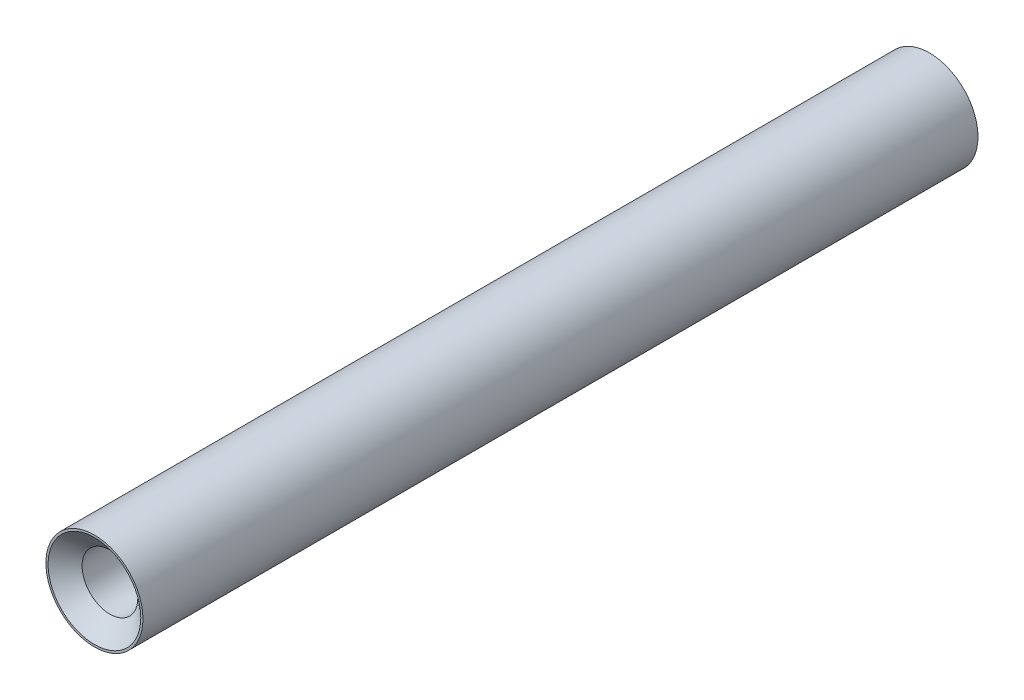
ISO-10303-21;
HEADER;
FILE_DESCRIPTION(('STEP AP214'),'2;1');
FILE_NAME('part.step','',(''),(''),'','','');
FILE_SCHEMA(('AUTOMOTIVE_DESIGN { 1 0 10303 214 1 1 1 1 }'));
ENDSEC;
DATA;
#1=APPLICATION_CONTEXT('core data for automotive mechanical design processes');
#2=APPLICATION_PROTOCOL_DEFINITION('international standard','automotive_design',2000,#1);
#3=PRODUCT_CONTEXT('',#1,'mechanical');
#4=PRODUCT('Part','Part','',(#3));
#5=PRODUCT_RELATED_PRODUCT_CATEGORY('part','',(#4));
#6=PRODUCT_DEFINITION_FORMATION('','',#4);
#7=PRODUCT_DEFINITION_CONTEXT('part definition',#1,'design');
#8=PRODUCT_DEFINITION('design','',#6,#7);
#9=PRODUCT_DEFINITION_SHAPE('','',#8);
#10=(LENGTH_UNIT() NAMED_UNIT(*) SI_UNIT(.MILLI.,.METRE.));
#11=(NAMED_UNIT(*) PLANE_ANGLE_UNIT() SI_UNIT($,.RADIAN.));
#12=(NAMED_UNIT(*) SI_UNIT($,.STERADIAN.) SOLID_ANGLE_UNIT());
#13=UNCERTAINTY_MEASURE_WITH_UNIT(LENGTH_MEASURE(1.E-05),#10,'distance_accuracy_value','');
#14=(GEOMETRIC_REPRESENTATION_CONTEXT(3) GLOBAL_UNCERTAINTY_ASSIGNED_CONTEXT((#13)) GLOBAL_UNIT_ASSIGNED_CONTEXT((#10,
#11,#12)) REPRESENTATION_CONTEXT('',''));
#15=CARTESIAN_POINT('',(0.,0.,0.));
#16=DIRECTION('',(0.,0.,1.));
#17=DIRECTION('',(1.,0.,0.));
#18=AXIS2_PLACEMENT_3D('',#15,#16,#17);
#19=CARTESIAN_POINT('',(0.,0.,43.02));
#20=DIRECTION('',(0.,0.,-1.));
#21=DIRECTION('',(-1.,0.,0.));
#22=AXIS2_PLACEMENT_3D('',#19,#20,#21);
#23=CYLINDRICAL_SURFACE('',#22,2.5);
#24=CARTESIAN_POINT('',(0.,0.,43.02));
#25=DIRECTION('',(0.,0.,1.));
#26=DIRECTION('',(1.,0.,0.));
#27=AXIS2_PLACEMENT_3D('',#24,#25,#26);
#28=CIRCLE('',#27,2.5);
#29=CARTESIAN_POINT('',(2.5,0.,43.02));
#30=VERTEX_POINT('',#29);
#31=EDGE_CURVE('E11',#30,#30,#28,.T.);
#32=ORIENTED_EDGE('',*,*,#31,.F.);
#33=EDGE_LOOP('',(#32));
#34=FACE_BOUND('',#33,.T.);
#35=CARTESIAN_POINT('',(0.,0.,0.));
#36=DIRECTION('',(0.,0.,1.));
#37=DIRECTION('',(1.,0.,0.));
#38=AXIS2_PLACEMENT_3D('',#35,#36,#37);
#39=CIRCLE('',#38,2.5);
#40=CARTESIAN_POINT('',(2.5,0.,0.));
#41=VERTEX_POINT('',#40);
#42=EDGE_CURVE('E40',#41,#41,#39,.T.);
#43=ORIENTED_EDGE('',*,*,#42,.T.);
#44=EDGE_LOOP('',(#43));
#45=FACE_BOUND('',#44,.T.);
#46=ADVANCED_FACE('F37',(#34,#45),#23,.T.);
#47=CARTESIAN_POINT('',(0.,0.,43.02));
#48=DIRECTION('',(0.,0.,1.));
#49=DIRECTION('',(1.,0.,0.));
#50=AXIS2_PLACEMENT_3D('',#47,#48,#49);
#51=PLANE('',#50);
#52=CARTESIAN_POINT('',(0.,0.,43.02));
#53=DIRECTION('',(0.,0.,1.));
#54=DIRECTION('',(1.,0.,0.));
#55=AXIS2_PLACEMENT_3D('',#52,#53,#54);
#56=CIRCLE('',#55,2.3876);
#57=CARTESIAN_POINT('',(2.3876,0.,43.02));
#58=VERTEX_POINT('',#57);
#59=EDGE_CURVE('E60',#58,#58,#56,.T.);
#60=ORIENTED_EDGE('',*,*,#59,.F.);
#61=EDGE_LOOP('',(#60));
#62=FACE_BOUND('',#61,.T.);
#63=ORIENTED_EDGE('',*,*,#31,.T.);
#64=EDGE_LOOP('',(#63));
#65=FACE_BOUND('',#64,.T.);
#66=ADVANCED_FACE('F84',(#62,#65),#51,.T.);
#67=CARTESIAN_POINT('',(0.,0.,0.));
#68=DIRECTION('',(0.,0.,1.));
#69=DIRECTION('',(1.,0.,0.));
#70=AXIS2_PLACEMENT_3D('',#67,#68,#69);
#71=PLANE('',#70);
#72=CARTESIAN_POINT('',(0.,0.,0.));
#73=DIRECTION('',(0.,0.,-1.));
#74=DIRECTION('',(-1.,0.,0.));
#75=AXIS2_PLACEMENT_3D('',#72,#73,#74);
#76=CIRCLE('',#75,2.3876);
#77=CARTESIAN_POINT('',(-2.3876,0.,0.));
#78=VERTEX_POINT('',#77);
#79=EDGE_CURVE('E67',#78,#78,#76,.T.);
#80=ORIENTED_EDGE('',*,*,#79,.F.);
#81=EDGE_LOOP('',(#80));
#82=FACE_BOUND('',#81,.T.);
#83=ORIENTED_EDGE('',*,*,#42,.F.);
#84=EDGE_LOOP('',(#83));
#85=FACE_BOUND('',#84,.T.);
#86=ADVANCED_FACE('F81',(#82,#85),#71,.F.);
#87=CARTESIAN_POINT('',(0.,0.,34.1));
#88=DIRECTION('',(0.,0.,1.));
#89=DIRECTION('',(1.,0.,0.));
#90=AXIS2_PLACEMENT_3D('',#87,#88,#89);
#91=CONICAL_SURFACE('',#90,1.4351,1.02974425867665);
#92=CARTESIAN_POINT('',(0.,0.,33.2377049256336));
#93=VERTEX_POINT('',#92);
#94=VERTEX_LOOP('',#93);
#95=FACE_BOUND('',#94,.T.);
#96=CARTESIAN_POINT('',(0.,0.,34.1));
#97=DIRECTION('',(0.,0.,1.));
#98=DIRECTION('',(1.,0.,0.));
#99=AXIS2_PLACEMENT_3D('',#96,#97,#98);
#100=CIRCLE('',#99,1.4351);
#101=CARTESIAN_POINT('',(1.4351,0.,34.1));
#102=VERTEX_POINT('',#101);
#103=EDGE_CURVE('E73',#102,#102,#100,.T.);
#104=ORIENTED_EDGE('',*,*,#103,.T.);
#105=EDGE_LOOP('',(#104));
#106=FACE_BOUND('',#105,.T.);
#107=ADVANCED_FACE('F83',(#95,#106),#91,.F.);
#108=CARTESIAN_POINT('',(0.,0.,43.02));
#109=DIRECTION('',(0.,0.,1.));
#110=DIRECTION('',(1.,0.,0.));
#111=AXIS2_PLACEMENT_3D('',#108,#109,#110);
#112=CYLINDRICAL_SURFACE('',#111,1.4351);
#113=ORIENTED_EDGE('',*,*,#103,.F.);
#114=EDGE_LOOP('',(#113));
#115=FACE_BOUND('',#114,.T.);
#116=CARTESIAN_POINT('',(0.,0.,42.2207576013036));
#117=DIRECTION('',(0.,0.,1.));
#118=DIRECTION('',(1.,0.,0.));
#119=AXIS2_PLACEMENT_3D('',#116,#117,#118);
#120=CIRCLE('',#119,1.4351);
#121=CARTESIAN_POINT('',(1.4351,0.,42.2207576013036));
#122=VERTEX_POINT('',#121);
#123=EDGE_CURVE('E64',#122,#122,#120,.T.);
#124=ORIENTED_EDGE('',*,*,#123,.T.);
#125=EDGE_LOOP('',(#124));
#126=FACE_BOUND('',#125,.T.);
#127=ADVANCED_FACE('F90',(#115,#126),#112,.F.);
#128=CARTESIAN_POINT('',(0.,0.,43.02));
#129=DIRECTION('',(0.,0.,1.));
#130=DIRECTION('',(1.,0.,0.));
#131=AXIS2_PLACEMENT_3D('',#128,#129,#130);
#132=CONICAL_SURFACE('',#131,2.3876,0.872664625997165);
#133=ORIENTED_EDGE('',*,*,#123,.F.);
#134=EDGE_LOOP('',(#133));
#135=FACE_BOUND('',#134,.T.);
#136=ORIENTED_EDGE('',*,*,#59,.T.);
#137=EDGE_LOOP('',(#136));
#138=FACE_BOUND('',#137,.T.);
#139=ADVANCED_FACE('F54',(#135,#138),#132,.F.);
#140=CARTESIAN_POINT('',(0.,0.,8.92));
#141=DIRECTION('',(0.,0.,-1.));
#142=DIRECTION('',(-1.,0.,0.));
#143=AXIS2_PLACEMENT_3D('',#140,#141,#142);
#144=CONICAL_SURFACE('',#143,1.4351,1.02974425867665);
#145=CARTESIAN_POINT('',(0.,0.,9.78229507436645));
#146=VERTEX_POINT('',#145);
#147=VERTEX_LOOP('',#146);
#148=FACE_BOUND('',#147,.T.);
#149=CARTESIAN_POINT('',(0.,0.,8.92));
#150=DIRECTION('',(0.,0.,-1.));
#151=DIRECTION('',(-1.,0.,0.));
#152=AXIS2_PLACEMENT_3D('',#149,#150,#151);
#153=CIRCLE('',#152,1.4351);
#154=CARTESIAN_POINT('',(-1.4351,0.,8.92));
#155=VERTEX_POINT('',#154);
#156=EDGE_CURVE('E58',#155,#155,#153,.T.);
#157=ORIENTED_EDGE('',*,*,#156,.T.);
#158=EDGE_LOOP('',(#157));
#159=FACE_BOUND('',#158,.T.);
#160=ADVANCED_FACE('F50',(#148,#159),#144,.F.);
#161=CARTESIAN_POINT('',(0.,0.,0.));
#162=DIRECTION('',(0.,0.,-1.));
#163=DIRECTION('',(-1.,0.,0.));
#164=AXIS2_PLACEMENT_3D('',#161,#162,#163);
#165=CYLINDRICAL_SURFACE('',#164,1.4351);
#166=ORIENTED_EDGE('',*,*,#156,.F.);
#167=EDGE_LOOP('',(#166));
#168=FACE_BOUND('',#167,.T.);
#169=CARTESIAN_POINT('',(0.,0.,0.799242398696361));
#170=DIRECTION('',(0.,0.,-1.));
#171=DIRECTION('',(-1.,0.,0.));
#172=AXIS2_PLACEMENT_3D('',#169,#170,#171);
#173=CIRCLE('',#172,1.4351);
#174=CARTESIAN_POINT('',(-1.4351,0.,0.799242398696361));
#175=VERTEX_POINT('',#174);
#176=EDGE_CURVE('E61',#175,#175,#173,.T.);
#177=ORIENTED_EDGE('',*,*,#176,.T.);
#178=EDGE_LOOP('',(#177));
#179=FACE_BOUND('',#178,.T.);
#180=ADVANCED_FACE('F53',(#168,#179),#165,.F.);
#181=CARTESIAN_POINT('',(0.,0.,0.));
#182=DIRECTION('',(0.,0.,-1.));
#183=DIRECTION('',(-1.,0.,0.));
#184=AXIS2_PLACEMENT_3D('',#181,#182,#183);
#185=CONICAL_SURFACE('',#184,2.3876,0.872664625997164);
#186=ORIENTED_EDGE('',*,*,#176,.F.);
#187=EDGE_LOOP('',(#186));
#188=FACE_BOUND('',#187,.T.);
#189=ORIENTED_EDGE('',*,*,#79,.T.);
#190=EDGE_LOOP('',(#189));
#191=FACE_BOUND('',#190,.T.);
#192=ADVANCED_FACE('F151',(#188,#191),#185,.F.);
#193=CLOSED_SHELL('',(#46,#66,#86,#107,#127,#139,#160,#180,#192));
#194=MANIFOLD_SOLID_BREP('B2',#193);
#195=ADVANCED_BREP_SHAPE_REPRESENTATION('',(#18,#194),#14);
#196=SHAPE_DEFINITION_REPRESENTATION(#9,#195);
ENDSEC;
END-ISO-10303-21;
